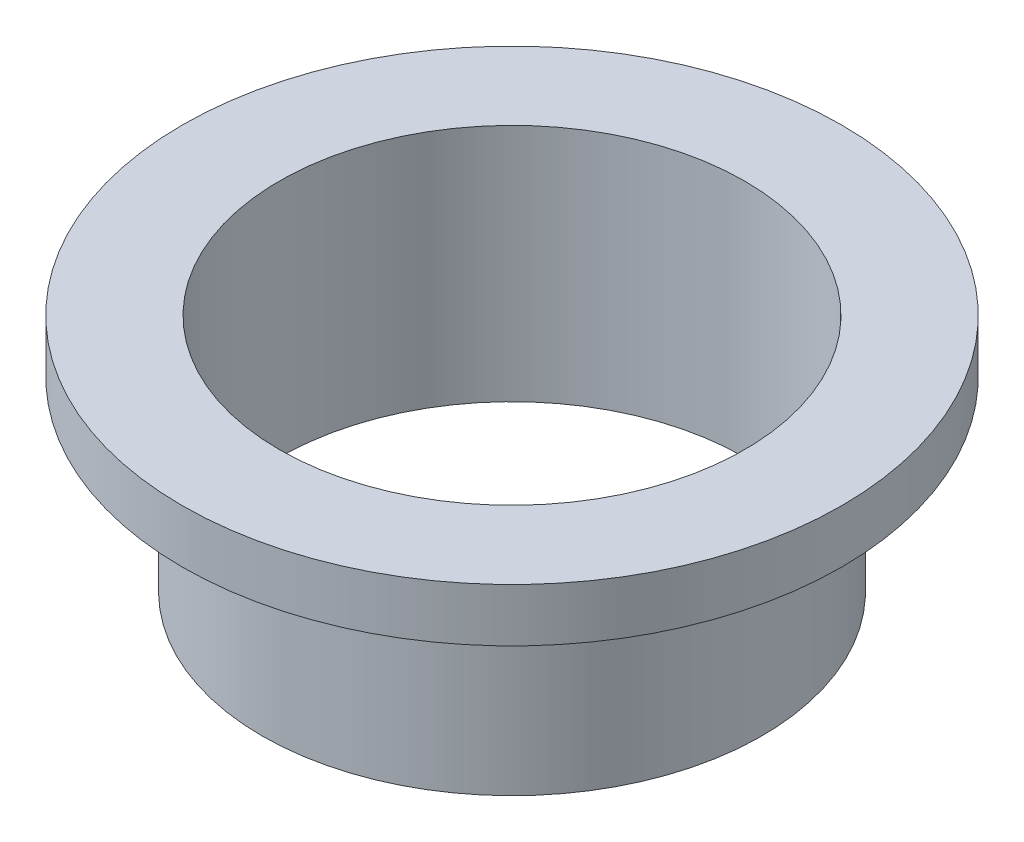
ISO-10303-21;
HEADER;
FILE_DESCRIPTION(('STEP AP214'),'2;1');
FILE_NAME('part.step','',(''),(''),'','','');
FILE_SCHEMA(('AUTOMOTIVE_DESIGN { 1 0 10303 214 1 1 1 1 }'));
ENDSEC;
DATA;
#1=APPLICATION_CONTEXT('core data for automotive mechanical design processes');
#2=APPLICATION_PROTOCOL_DEFINITION('international standard','automotive_design',2000,#1);
#3=PRODUCT_CONTEXT('',#1,'mechanical');
#4=PRODUCT('Part','Part','',(#3));
#5=PRODUCT_RELATED_PRODUCT_CATEGORY('part','',(#4));
#6=PRODUCT_DEFINITION_FORMATION('','',#4);
#7=PRODUCT_DEFINITION_CONTEXT('part definition',#1,'design');
#8=PRODUCT_DEFINITION('design','',#6,#7);
#9=PRODUCT_DEFINITION_SHAPE('','',#8);
#10=(LENGTH_UNIT() NAMED_UNIT(*) SI_UNIT(.MILLI.,.METRE.));
#11=(NAMED_UNIT(*) PLANE_ANGLE_UNIT() SI_UNIT($,.RADIAN.));
#12=(NAMED_UNIT(*) SI_UNIT($,.STERADIAN.) SOLID_ANGLE_UNIT());
#13=UNCERTAINTY_MEASURE_WITH_UNIT(LENGTH_MEASURE(1.E-05),#10,'distance_accuracy_value','');
#14=(GEOMETRIC_REPRESENTATION_CONTEXT(3) GLOBAL_UNCERTAINTY_ASSIGNED_CONTEXT((#13)) GLOBAL_UNIT_ASSIGNED_CONTEXT((#10,
#11,#12)) REPRESENTATION_CONTEXT('',''));
#15=CARTESIAN_POINT('',(0.,0.,0.));
#16=DIRECTION('',(0.,0.,1.));
#17=DIRECTION('',(1.,0.,0.));
#18=AXIS2_PLACEMENT_3D('',#15,#16,#17);
#19=CARTESIAN_POINT('',(0.,2.,0.));
#20=DIRECTION('',(0.,-1.,0.));
#21=DIRECTION('',(0.,0.,-1.));
#22=AXIS2_PLACEMENT_3D('',#19,#20,#21);
#23=CYLINDRICAL_SURFACE('',#22,12.4);
#24=CARTESIAN_POINT('',(0.,2.,0.));
#25=DIRECTION('',(0.,1.,0.));
#26=DIRECTION('',(0.,0.,1.));
#27=AXIS2_PLACEMENT_3D('',#24,#25,#26);
#28=CIRCLE('',#27,12.4);
#29=CARTESIAN_POINT('',(0.,2.,12.4));
#30=VERTEX_POINT('',#29);
#31=EDGE_CURVE('E38',#30,#30,#28,.T.);
#32=ORIENTED_EDGE('',*,*,#31,.F.);
#33=EDGE_LOOP('',(#32));
#34=FACE_BOUND('',#33,.T.);
#35=CARTESIAN_POINT('',(0.,0.,0.));
#36=DIRECTION('',(0.,1.,0.));
#37=DIRECTION('',(0.,0.,1.));
#38=AXIS2_PLACEMENT_3D('',#35,#36,#37);
#39=CIRCLE('',#38,12.4);
#40=CARTESIAN_POINT('',(0.,0.,12.4));
#41=VERTEX_POINT('',#40);
#42=EDGE_CURVE('E34',#41,#41,#39,.T.);
#43=ORIENTED_EDGE('',*,*,#42,.T.);
#44=EDGE_LOOP('',(#43));
#45=FACE_BOUND('',#44,.T.);
#46=ADVANCED_FACE('F31',(#34,#45),#23,.T.);
#47=CARTESIAN_POINT('',(0.,2.,0.));
#48=DIRECTION('',(0.,-1.,0.));
#49=DIRECTION('',(0.,0.,-1.));
#50=AXIS2_PLACEMENT_3D('',#47,#48,#49);
#51=CYLINDRICAL_SURFACE('',#50,8.75);
#52=CARTESIAN_POINT('',(0.,2.,0.));
#53=DIRECTION('',(0.,1.,0.));
#54=DIRECTION('',(0.,0.,1.));
#55=AXIS2_PLACEMENT_3D('',#52,#53,#54);
#56=CIRCLE('',#55,8.75);
#57=CARTESIAN_POINT('',(0.,2.,8.75));
#58=VERTEX_POINT('',#57);
#59=EDGE_CURVE('E10',#58,#58,#56,.T.);
#60=ORIENTED_EDGE('',*,*,#59,.T.);
#61=EDGE_LOOP('',(#60));
#62=FACE_BOUND('',#61,.T.);
#63=CARTESIAN_POINT('',(0.,-7.,0.));
#64=DIRECTION('',(0.,1.,0.));
#65=DIRECTION('',(0.,0.,1.));
#66=AXIS2_PLACEMENT_3D('',#63,#64,#65);
#67=CIRCLE('',#66,8.75);
#68=CARTESIAN_POINT('',(0.,-7.,8.75));
#69=VERTEX_POINT('',#68);
#70=EDGE_CURVE('E47',#69,#69,#67,.T.);
#71=ORIENTED_EDGE('',*,*,#70,.F.);
#72=EDGE_LOOP('',(#71));
#73=FACE_BOUND('',#72,.T.);
#74=ADVANCED_FACE('F57',(#62,#73),#51,.F.);
#75=CARTESIAN_POINT('',(0.,2.,0.));
#76=DIRECTION('',(0.,1.,0.));
#77=DIRECTION('',(0.,0.,1.));
#78=AXIS2_PLACEMENT_3D('',#75,#76,#77);
#79=PLANE('',#78);
#80=ORIENTED_EDGE('',*,*,#31,.T.);
#81=EDGE_LOOP('',(#80));
#82=FACE_BOUND('',#81,.T.);
#83=ORIENTED_EDGE('',*,*,#59,.F.);
#84=EDGE_LOOP('',(#83));
#85=FACE_BOUND('',#84,.T.);
#86=ADVANCED_FACE('F59',(#82,#85),#79,.T.);
#87=CARTESIAN_POINT('',(0.,0.,0.));
#88=DIRECTION('',(0.,1.,0.));
#89=DIRECTION('',(0.,0.,1.));
#90=AXIS2_PLACEMENT_3D('',#87,#88,#89);
#91=PLANE('',#90);
#92=CARTESIAN_POINT('',(0.,0.,0.));
#93=DIRECTION('',(0.,1.,0.));
#94=DIRECTION('',(0.,0.,1.));
#95=AXIS2_PLACEMENT_3D('',#92,#93,#94);
#96=CIRCLE('',#95,9.4);
#97=CARTESIAN_POINT('',(0.,0.,9.4));
#98=VERTEX_POINT('',#97);
#99=EDGE_CURVE('E44',#98,#98,#96,.T.);
#100=ORIENTED_EDGE('',*,*,#99,.T.);
#101=EDGE_LOOP('',(#100));
#102=FACE_BOUND('',#101,.T.);
#103=ORIENTED_EDGE('',*,*,#42,.F.);
#104=EDGE_LOOP('',(#103));
#105=FACE_BOUND('',#104,.T.);
#106=ADVANCED_FACE('F64',(#102,#105),#91,.F.);
#107=CARTESIAN_POINT('',(0.,-7.,0.));
#108=DIRECTION('',(0.,1.,0.));
#109=DIRECTION('',(0.,0.,1.));
#110=AXIS2_PLACEMENT_3D('',#107,#108,#109);
#111=CYLINDRICAL_SURFACE('',#110,9.4);
#112=CARTESIAN_POINT('',(0.,-7.,0.));
#113=DIRECTION('',(0.,1.,0.));
#114=DIRECTION('',(0.,0.,1.));
#115=AXIS2_PLACEMENT_3D('',#112,#113,#114);
#116=CIRCLE('',#115,9.4);
#117=CARTESIAN_POINT('',(0.,-7.,9.4));
#118=VERTEX_POINT('',#117);
#119=EDGE_CURVE('E48',#118,#118,#116,.T.);
#120=ORIENTED_EDGE('',*,*,#119,.T.);
#121=EDGE_LOOP('',(#120));
#122=FACE_BOUND('',#121,.T.);
#123=ORIENTED_EDGE('',*,*,#99,.F.);
#124=EDGE_LOOP('',(#123));
#125=FACE_BOUND('',#124,.T.);
#126=ADVANCED_FACE('F70',(#122,#125),#111,.T.);
#127=CARTESIAN_POINT('',(0.,-7.,0.));
#128=DIRECTION('',(0.,1.,0.));
#129=DIRECTION('',(0.,0.,1.));
#130=AXIS2_PLACEMENT_3D('',#127,#128,#129);
#131=PLANE('',#130);
#132=ORIENTED_EDGE('',*,*,#70,.T.);
#133=EDGE_LOOP('',(#132));
#134=FACE_BOUND('',#133,.T.);
#135=ORIENTED_EDGE('',*,*,#119,.F.);
#136=EDGE_LOOP('',(#135));
#137=FACE_BOUND('',#136,.T.);
#138=ADVANCED_FACE('F54',(#134,#137),#131,.F.);
#139=CLOSED_SHELL('',(#46,#74,#86,#106,#126,#138));
#140=MANIFOLD_SOLID_BREP('B2',#139);
#141=ADVANCED_BREP_SHAPE_REPRESENTATION('',(#18,#140),#14);
#142=SHAPE_DEFINITION_REPRESENTATION(#9,#141);
ENDSEC;
END-ISO-10303-21;
